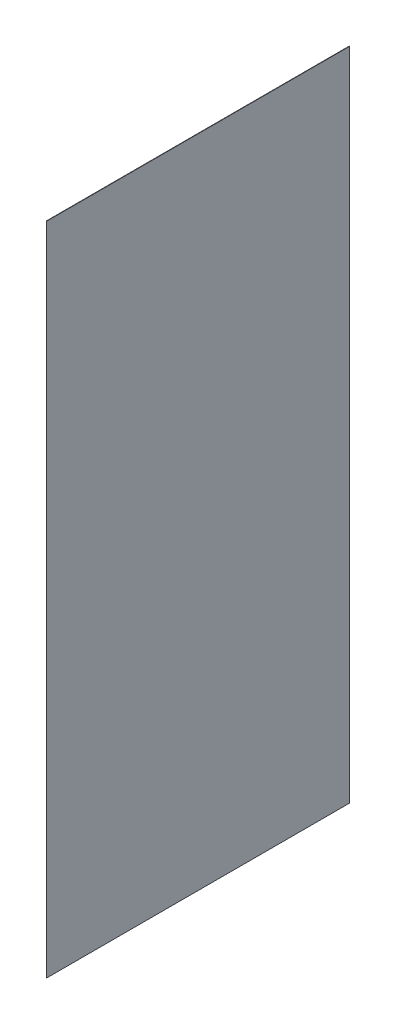
ISO-10303-21;
HEADER;
FILE_DESCRIPTION(('STEP AP214'),'2;1');
FILE_NAME('part.step','',(''),(''),'','','');
FILE_SCHEMA(('AUTOMOTIVE_DESIGN { 1 0 10303 214 1 1 1 1 }'));
ENDSEC;
DATA;
#1=APPLICATION_CONTEXT('core data for automotive mechanical design processes');
#2=APPLICATION_PROTOCOL_DEFINITION('international standard','automotive_design',2000,#1);
#3=PRODUCT_CONTEXT('',#1,'mechanical');
#4=PRODUCT('Part','Part','',(#3));
#5=PRODUCT_RELATED_PRODUCT_CATEGORY('part','',(#4));
#6=PRODUCT_DEFINITION_FORMATION('','',#4);
#7=PRODUCT_DEFINITION_CONTEXT('part definition',#1,'design');
#8=PRODUCT_DEFINITION('design','',#6,#7);
#9=PRODUCT_DEFINITION_SHAPE('','',#8);
#10=(LENGTH_UNIT() NAMED_UNIT(*) SI_UNIT(.MILLI.,.METRE.));
#11=(NAMED_UNIT(*) PLANE_ANGLE_UNIT() SI_UNIT($,.RADIAN.));
#12=(NAMED_UNIT(*) SI_UNIT($,.STERADIAN.) SOLID_ANGLE_UNIT());
#13=UNCERTAINTY_MEASURE_WITH_UNIT(LENGTH_MEASURE(1.E-05),#10,'distance_accuracy_value','');
#14=(GEOMETRIC_REPRESENTATION_CONTEXT(3) GLOBAL_UNCERTAINTY_ASSIGNED_CONTEXT((#13)) GLOBAL_UNIT_ASSIGNED_CONTEXT((#10,
#11,#12)) REPRESENTATION_CONTEXT('',''));
#15=CARTESIAN_POINT('',(0.,0.,0.));
#16=DIRECTION('',(0.,0.,1.));
#17=DIRECTION('',(1.,0.,0.));
#18=AXIS2_PLACEMENT_3D('',#15,#16,#17);
#19=CARTESIAN_POINT('',(41.5,241.5,-798.5));
#20=DIRECTION('',(-1.,0.,0.));
#21=DIRECTION('',(0.,0.,1.));
#22=AXIS2_PLACEMENT_3D('',#19,#20,#21);
#23=PLANE('',#22);
#24=DIRECTION('',(0.,-1.,0.));
#25=VECTOR('',#24,1.);
#26=CARTESIAN_POINT('',(41.5,241.5,0.));
#27=LINE('',#26,#25);
#28=CARTESIAN_POINT('',(41.5,1968.5,0.));
#29=VERTEX_POINT('',#28);
#30=CARTESIAN_POINT('',(41.5,241.5,0.));
#31=VERTEX_POINT('',#30);
#32=EDGE_CURVE('E103',#29,#31,#27,.T.);
#33=ORIENTED_EDGE('',*,*,#32,.F.);
#34=DIRECTION('',(0.,0.,1.));
#35=VECTOR('',#34,1.);
#36=CARTESIAN_POINT('',(41.5,1968.5,-798.5));
#37=LINE('',#36,#35);
#38=CARTESIAN_POINT('',(41.5,1968.5,-798.5));
#39=VERTEX_POINT('',#38);
#40=EDGE_CURVE('E11',#39,#29,#37,.T.);
#41=ORIENTED_EDGE('',*,*,#40,.F.);
#42=DIRECTION('',(0.,-1.,0.));
#43=VECTOR('',#42,1.);
#44=CARTESIAN_POINT('',(41.5,241.5,-798.5));
#45=LINE('',#44,#43);
#46=CARTESIAN_POINT('',(41.5,241.5,-798.5));
#47=VERTEX_POINT('',#46);
#48=EDGE_CURVE('E97',#39,#47,#45,.T.);
#49=ORIENTED_EDGE('',*,*,#48,.T.);
#50=DIRECTION('',(0.,0.,1.));
#51=VECTOR('',#50,1.);
#52=CARTESIAN_POINT('',(41.5,241.5,-798.5));
#53=LINE('',#52,#51);
#54=EDGE_CURVE('E42',#47,#31,#53,.T.);
#55=ORIENTED_EDGE('',*,*,#54,.T.);
#56=EDGE_LOOP('',(#33,#41,#49,#55));
#57=FACE_BOUND('',#56,.T.);
#58=ADVANCED_FACE('F39',(#57),#23,.T.);
#59=CARTESIAN_POINT('',(41.5,1968.5,-798.5));
#60=DIRECTION('',(0.,1.,0.));
#61=DIRECTION('',(0.,0.,1.));
#62=AXIS2_PLACEMENT_3D('',#59,#60,#61);
#63=PLANE('',#62);
#64=DIRECTION('',(-1.,0.,0.));
#65=VECTOR('',#64,1.);
#66=CARTESIAN_POINT('',(41.5,1968.5,0.));
#67=LINE('',#66,#65);
#68=CARTESIAN_POINT('',(42.5,1968.5,0.));
#69=VERTEX_POINT('',#68);
#70=EDGE_CURVE('E99',#69,#29,#67,.T.);
#71=ORIENTED_EDGE('',*,*,#70,.F.);
#72=DIRECTION('',(0.,0.,1.));
#73=VECTOR('',#72,1.);
#74=CARTESIAN_POINT('',(42.5,1968.5,-798.5));
#75=LINE('',#74,#73);
#76=CARTESIAN_POINT('',(42.5,1968.5,-798.5));
#77=VERTEX_POINT('',#76);
#78=EDGE_CURVE('E48',#77,#69,#75,.T.);
#79=ORIENTED_EDGE('',*,*,#78,.F.);
#80=DIRECTION('',(-1.,0.,0.));
#81=VECTOR('',#80,1.);
#82=CARTESIAN_POINT('',(41.5,1968.5,-798.5));
#83=LINE('',#82,#81);
#84=EDGE_CURVE('E94',#77,#39,#83,.T.);
#85=ORIENTED_EDGE('',*,*,#84,.T.);
#86=ORIENTED_EDGE('',*,*,#40,.T.);
#87=EDGE_LOOP('',(#71,#79,#85,#86));
#88=FACE_BOUND('',#87,.T.);
#89=ADVANCED_FACE('F113',(#88),#63,.T.);
#90=CARTESIAN_POINT('',(42.5,241.5,-798.5));
#91=DIRECTION('',(1.,0.,0.));
#92=DIRECTION('',(0.,0.,-1.));
#93=AXIS2_PLACEMENT_3D('',#90,#91,#92);
#94=PLANE('',#93);
#95=DIRECTION('',(0.,1.,0.));
#96=VECTOR('',#95,1.);
#97=CARTESIAN_POINT('',(42.5,241.5,0.));
#98=LINE('',#97,#96);
#99=CARTESIAN_POINT('',(42.5,241.5,0.));
#100=VERTEX_POINT('',#99);
#101=EDGE_CURVE('E89',#100,#69,#98,.T.);
#102=ORIENTED_EDGE('',*,*,#101,.F.);
#103=DIRECTION('',(0.,0.,1.));
#104=VECTOR('',#103,1.);
#105=CARTESIAN_POINT('',(42.5,241.5,-798.5));
#106=LINE('',#105,#104);
#107=CARTESIAN_POINT('',(42.5,241.5,-798.5));
#108=VERTEX_POINT('',#107);
#109=EDGE_CURVE('E84',#108,#100,#106,.T.);
#110=ORIENTED_EDGE('',*,*,#109,.F.);
#111=DIRECTION('',(0.,1.,0.));
#112=VECTOR('',#111,1.);
#113=CARTESIAN_POINT('',(42.5,241.5,-798.5));
#114=LINE('',#113,#112);
#115=EDGE_CURVE('E87',#108,#77,#114,.T.);
#116=ORIENTED_EDGE('',*,*,#115,.T.);
#117=ORIENTED_EDGE('',*,*,#78,.T.);
#118=EDGE_LOOP('',(#102,#110,#116,#117));
#119=FACE_BOUND('',#118,.T.);
#120=ADVANCED_FACE('F86',(#119),#94,.T.);
#121=CARTESIAN_POINT('',(41.5,241.5,-798.5));
#122=DIRECTION('',(0.,-1.,0.));
#123=DIRECTION('',(0.,0.,-1.));
#124=AXIS2_PLACEMENT_3D('',#121,#122,#123);
#125=PLANE('',#124);
#126=DIRECTION('',(1.,0.,0.));
#127=VECTOR('',#126,1.);
#128=CARTESIAN_POINT('',(41.5,241.5,0.));
#129=LINE('',#128,#127);
#130=EDGE_CURVE('E106',#31,#100,#129,.T.);
#131=ORIENTED_EDGE('',*,*,#130,.F.);
#132=ORIENTED_EDGE('',*,*,#54,.F.);
#133=DIRECTION('',(1.,0.,0.));
#134=VECTOR('',#133,1.);
#135=CARTESIAN_POINT('',(41.5,241.5,-798.5));
#136=LINE('',#135,#134);
#137=EDGE_CURVE('E93',#47,#108,#136,.T.);
#138=ORIENTED_EDGE('',*,*,#137,.T.);
#139=ORIENTED_EDGE('',*,*,#109,.T.);
#140=EDGE_LOOP('',(#131,#132,#138,#139));
#141=FACE_BOUND('',#140,.T.);
#142=ADVANCED_FACE('F96',(#141),#125,.T.);
#143=CARTESIAN_POINT('',(0.,0.,-798.5));
#144=DIRECTION('',(0.,0.,-1.));
#145=DIRECTION('',(-1.,0.,0.));
#146=AXIS2_PLACEMENT_3D('',#143,#144,#145);
#147=PLANE('',#146);
#148=ORIENTED_EDGE('',*,*,#48,.F.);
#149=ORIENTED_EDGE('',*,*,#84,.F.);
#150=ORIENTED_EDGE('',*,*,#115,.F.);
#151=ORIENTED_EDGE('',*,*,#137,.F.);
#152=EDGE_LOOP('',(#148,#149,#150,#151));
#153=FACE_BOUND('',#152,.T.);
#154=ADVANCED_FACE('F92',(#153),#147,.T.);
#155=CARTESIAN_POINT('',(0.,0.,0.));
#156=DIRECTION('',(0.,0.,-1.));
#157=DIRECTION('',(-1.,0.,0.));
#158=AXIS2_PLACEMENT_3D('',#155,#156,#157);
#159=PLANE('',#158);
#160=ORIENTED_EDGE('',*,*,#32,.T.);
#161=ORIENTED_EDGE('',*,*,#130,.T.);
#162=ORIENTED_EDGE('',*,*,#101,.T.);
#163=ORIENTED_EDGE('',*,*,#70,.T.);
#164=EDGE_LOOP('',(#160,#161,#162,#163));
#165=FACE_BOUND('',#164,.T.);
#166=ADVANCED_FACE('F112',(#165),#159,.F.);
#167=CLOSED_SHELL('',(#58,#89,#120,#142,#154,#166));
#168=MANIFOLD_SOLID_BREP('B2',#167);
#169=ADVANCED_BREP_SHAPE_REPRESENTATION('',(#18,#168),#14);
#170=SHAPE_DEFINITION_REPRESENTATION(#9,#169);
ENDSEC;
END-ISO-10303-21;
